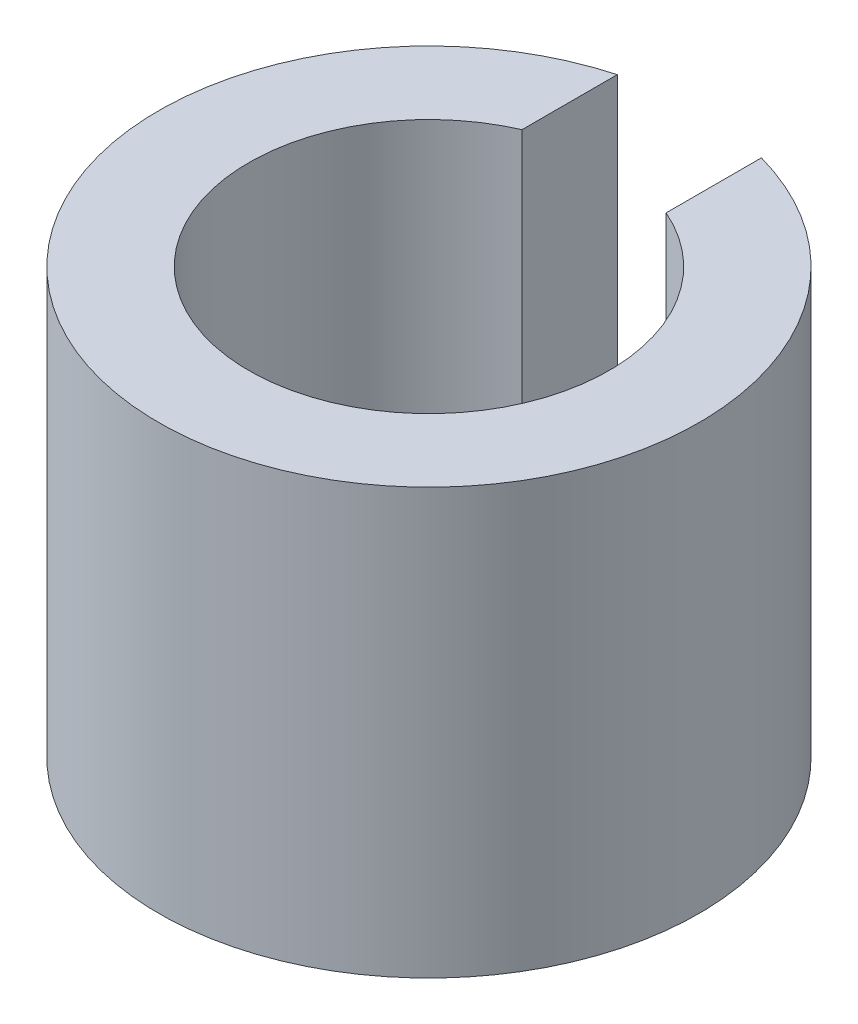
ISO-10303-21;
HEADER;
FILE_DESCRIPTION(('STEP AP214'),'2;1');
FILE_NAME('part.step','',(''),(''),'','','');
FILE_SCHEMA(('AUTOMOTIVE_DESIGN { 1 0 10303 214 1 1 1 1 }'));
ENDSEC;
DATA;
#1=APPLICATION_CONTEXT('core data for automotive mechanical design processes');
#2=APPLICATION_PROTOCOL_DEFINITION('international standard','automotive_design',2000,#1);
#3=PRODUCT_CONTEXT('',#1,'mechanical');
#4=PRODUCT('Part','Part','',(#3));
#5=PRODUCT_RELATED_PRODUCT_CATEGORY('part','',(#4));
#6=PRODUCT_DEFINITION_FORMATION('','',#4);
#7=PRODUCT_DEFINITION_CONTEXT('part definition',#1,'design');
#8=PRODUCT_DEFINITION('design','',#6,#7);
#9=PRODUCT_DEFINITION_SHAPE('','',#8);
#10=(LENGTH_UNIT() NAMED_UNIT(*) SI_UNIT(.MILLI.,.METRE.));
#11=(NAMED_UNIT(*) PLANE_ANGLE_UNIT() SI_UNIT($,.RADIAN.));
#12=(NAMED_UNIT(*) SI_UNIT($,.STERADIAN.) SOLID_ANGLE_UNIT());
#13=UNCERTAINTY_MEASURE_WITH_UNIT(LENGTH_MEASURE(1.E-05),#10,'distance_accuracy_value','');
#14=(GEOMETRIC_REPRESENTATION_CONTEXT(3) GLOBAL_UNCERTAINTY_ASSIGNED_CONTEXT((#13)) GLOBAL_UNIT_ASSIGNED_CONTEXT((#10,
#11,#12)) REPRESENTATION_CONTEXT('',''));
#15=CARTESIAN_POINT('',(0.,0.,0.));
#16=DIRECTION('',(0.,0.,1.));
#17=DIRECTION('',(1.,0.,0.));
#18=AXIS2_PLACEMENT_3D('',#15,#16,#17);
#19=CARTESIAN_POINT('',(0.,11.8,0.));
#20=DIRECTION('',(0.,1.,0.));
#21=DIRECTION('',(0.,0.,1.));
#22=AXIS2_PLACEMENT_3D('',#19,#20,#21);
#23=PLANE('',#22);
#24=DIRECTION('',(0.,0.,-1.));
#25=VECTOR('',#24,1.);
#26=CARTESIAN_POINT('',(2.,11.8,-7.94230657639372));
#27=LINE('',#26,#25);
#28=CARTESIAN_POINT('',(1.99999999999999,11.8,-4.58257569495585));
#29=VERTEX_POINT('',#28);
#30=CARTESIAN_POINT('',(2.,11.8,-7.22841614740048));
#31=VERTEX_POINT('',#30);
#32=EDGE_CURVE('E99',#29,#31,#27,.T.);
#33=ORIENTED_EDGE('',*,*,#32,.F.);
#34=CARTESIAN_POINT('',(0.,11.8,0.));
#35=DIRECTION('',(0.,1.,0.));
#36=DIRECTION('',(0.,0.,1.));
#37=AXIS2_PLACEMENT_3D('',#34,#35,#36);
#38=CIRCLE('',#37,5.);
#39=CARTESIAN_POINT('',(-2.,11.8,-4.58257569495584));
#40=VERTEX_POINT('',#39);
#41=EDGE_CURVE('E98',#40,#29,#38,.T.);
#42=ORIENTED_EDGE('',*,*,#41,.F.);
#43=DIRECTION('',(0.,0.,1.));
#44=VECTOR('',#43,1.);
#45=CARTESIAN_POINT('',(-2.,11.8,-7.94230657639372));
#46=LINE('',#45,#44);
#47=CARTESIAN_POINT('',(-2.,11.8,-7.22841614740048));
#48=VERTEX_POINT('',#47);
#49=EDGE_CURVE('E65',#48,#40,#46,.T.);
#50=ORIENTED_EDGE('',*,*,#49,.F.);
#51=CARTESIAN_POINT('',(0.,11.8,0.));
#52=DIRECTION('',(0.,1.,0.));
#53=DIRECTION('',(0.,0.,1.));
#54=AXIS2_PLACEMENT_3D('',#51,#52,#53);
#55=CIRCLE('',#54,7.5);
#56=EDGE_CURVE('E96',#48,#31,#55,.T.);
#57=ORIENTED_EDGE('',*,*,#56,.T.);
#58=EDGE_LOOP('',(#33,#42,#50,#57));
#59=FACE_BOUND('',#58,.T.);
#60=ADVANCED_FACE('F43',(#59),#23,.T.);
#61=CARTESIAN_POINT('',(0.,0.,0.));
#62=DIRECTION('',(0.,1.,0.));
#63=DIRECTION('',(0.,0.,1.));
#64=AXIS2_PLACEMENT_3D('',#61,#62,#63);
#65=PLANE('',#64);
#66=CARTESIAN_POINT('',(0.,0.,0.));
#67=DIRECTION('',(0.,1.,0.));
#68=DIRECTION('',(0.,0.,1.));
#69=AXIS2_PLACEMENT_3D('',#66,#67,#68);
#70=CIRCLE('',#69,5.);
#71=CARTESIAN_POINT('',(-2.,0.,-4.58257569495584));
#72=VERTEX_POINT('',#71);
#73=CARTESIAN_POINT('',(1.99999999999999,0.,-4.58257569495585));
#74=VERTEX_POINT('',#73);
#75=EDGE_CURVE('E107',#72,#74,#70,.T.);
#76=ORIENTED_EDGE('',*,*,#75,.T.);
#77=DIRECTION('',(0.,0.,-1.));
#78=VECTOR('',#77,1.);
#79=CARTESIAN_POINT('',(2.,0.,-7.94230657639372));
#80=LINE('',#79,#78);
#81=CARTESIAN_POINT('',(2.,0.,-7.22841614740048));
#82=VERTEX_POINT('',#81);
#83=EDGE_CURVE('E57',#74,#82,#80,.T.);
#84=ORIENTED_EDGE('',*,*,#83,.T.);
#85=CARTESIAN_POINT('',(0.,0.,0.));
#86=DIRECTION('',(0.,1.,0.));
#87=DIRECTION('',(0.,0.,1.));
#88=AXIS2_PLACEMENT_3D('',#85,#86,#87);
#89=CIRCLE('',#88,7.5);
#90=CARTESIAN_POINT('',(-2.,0.,-7.22841614740048));
#91=VERTEX_POINT('',#90);
#92=EDGE_CURVE('E102',#91,#82,#89,.T.);
#93=ORIENTED_EDGE('',*,*,#92,.F.);
#94=DIRECTION('',(0.,0.,1.));
#95=VECTOR('',#94,1.);
#96=CARTESIAN_POINT('',(-2.,0.,-7.94230657639372));
#97=LINE('',#96,#95);
#98=EDGE_CURVE('E85',#91,#72,#97,.T.);
#99=ORIENTED_EDGE('',*,*,#98,.T.);
#100=EDGE_LOOP('',(#76,#84,#93,#99));
#101=FACE_BOUND('',#100,.T.);
#102=ADVANCED_FACE('F118',(#101),#65,.F.);
#103=CARTESIAN_POINT('',(0.,11.8,0.));
#104=DIRECTION('',(0.,-1.,0.));
#105=DIRECTION('',(0.,0.,-1.));
#106=AXIS2_PLACEMENT_3D('',#103,#104,#105);
#107=CYLINDRICAL_SURFACE('',#106,7.5);
#108=ORIENTED_EDGE('',*,*,#92,.T.);
#109=DIRECTION('',(0.,-1.,0.));
#110=VECTOR('',#109,1.);
#111=CARTESIAN_POINT('',(2.,11.8,-7.22841614740048));
#112=LINE('',#111,#110);
#113=EDGE_CURVE('E90',#82,#31,#112,.F.);
#114=ORIENTED_EDGE('',*,*,#113,.T.);
#115=ORIENTED_EDGE('',*,*,#56,.F.);
#116=DIRECTION('',(0.,-1.,0.));
#117=VECTOR('',#116,1.);
#118=CARTESIAN_POINT('',(-2.,11.8,-7.22841614740048));
#119=LINE('',#118,#117);
#120=EDGE_CURVE('E82',#48,#91,#119,.T.);
#121=ORIENTED_EDGE('',*,*,#120,.T.);
#122=EDGE_LOOP('',(#108,#114,#115,#121));
#123=FACE_BOUND('',#122,.T.);
#124=ADVANCED_FACE('F45',(#123),#107,.T.);
#125=CARTESIAN_POINT('',(0.,11.8,0.));
#126=DIRECTION('',(0.,-1.,0.));
#127=DIRECTION('',(0.,0.,-1.));
#128=AXIS2_PLACEMENT_3D('',#125,#126,#127);
#129=CYLINDRICAL_SURFACE('',#128,5.);
#130=DIRECTION('',(0.,-1.,0.));
#131=VECTOR('',#130,1.);
#132=CARTESIAN_POINT('',(1.99999999999999,11.8,-4.58257569495585));
#133=LINE('',#132,#131);
#134=EDGE_CURVE('E11',#74,#29,#133,.F.);
#135=ORIENTED_EDGE('',*,*,#134,.F.);
#136=ORIENTED_EDGE('',*,*,#75,.F.);
#137=DIRECTION('',(0.,-1.,0.));
#138=VECTOR('',#137,1.);
#139=CARTESIAN_POINT('',(-2.,11.8,-4.58257569495584));
#140=LINE('',#139,#138);
#141=EDGE_CURVE('E51',#40,#72,#140,.T.);
#142=ORIENTED_EDGE('',*,*,#141,.F.);
#143=ORIENTED_EDGE('',*,*,#41,.T.);
#144=EDGE_LOOP('',(#135,#136,#142,#143));
#145=FACE_BOUND('',#144,.T.);
#146=ADVANCED_FACE('F120',(#145),#129,.F.);
#147=CARTESIAN_POINT('',(-2.,0.,-7.94230657639372));
#148=DIRECTION('',(-1.,0.,0.));
#149=DIRECTION('',(0.,0.,1.));
#150=AXIS2_PLACEMENT_3D('',#147,#148,#149);
#151=PLANE('',#150);
#152=ORIENTED_EDGE('',*,*,#49,.T.);
#153=ORIENTED_EDGE('',*,*,#141,.T.);
#154=ORIENTED_EDGE('',*,*,#98,.F.);
#155=ORIENTED_EDGE('',*,*,#120,.F.);
#156=EDGE_LOOP('',(#152,#153,#154,#155));
#157=FACE_BOUND('',#156,.T.);
#158=ADVANCED_FACE('F83',(#157),#151,.F.);
#159=CARTESIAN_POINT('',(2.,0.,-7.94230657639372));
#160=DIRECTION('',(1.,0.,0.));
#161=DIRECTION('',(0.,0.,-1.));
#162=AXIS2_PLACEMENT_3D('',#159,#160,#161);
#163=PLANE('',#162);
#164=ORIENTED_EDGE('',*,*,#83,.F.);
#165=ORIENTED_EDGE('',*,*,#134,.T.);
#166=ORIENTED_EDGE('',*,*,#32,.T.);
#167=ORIENTED_EDGE('',*,*,#113,.F.);
#168=EDGE_LOOP('',(#164,#165,#166,#167));
#169=FACE_BOUND('',#168,.T.);
#170=ADVANCED_FACE('F121',(#169),#163,.F.);
#171=CLOSED_SHELL('',(#60,#102,#124,#146,#158,#170));
#172=MANIFOLD_SOLID_BREP('B2',#171);
#173=ADVANCED_BREP_SHAPE_REPRESENTATION('',(#18,#172),#14);
#174=SHAPE_DEFINITION_REPRESENTATION(#9,#173);
ENDSEC;
END-ISO-10303-21;
